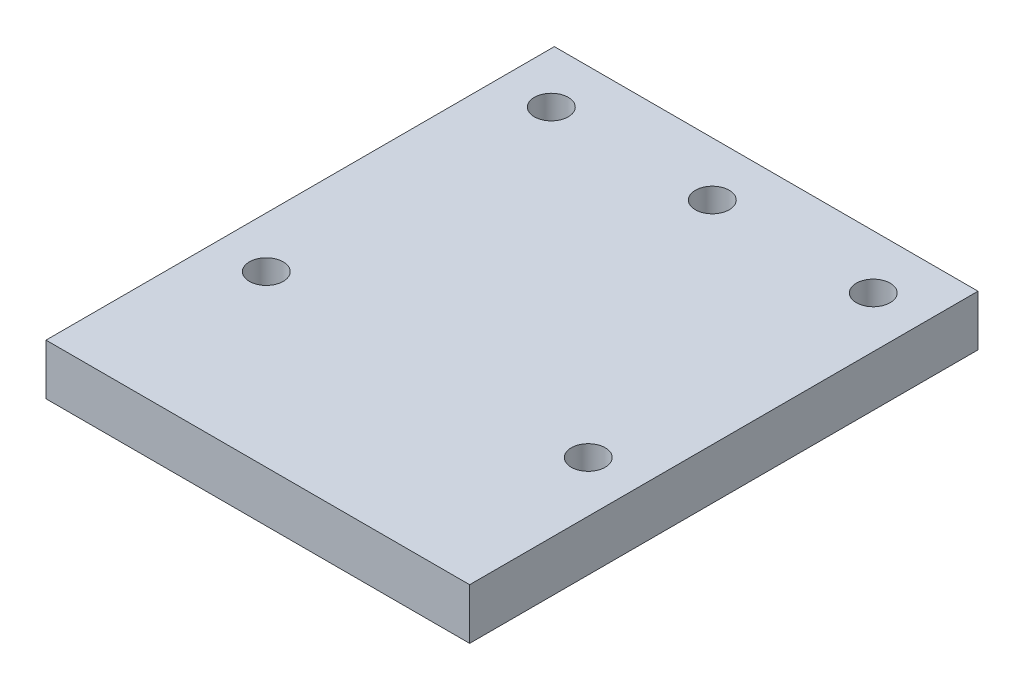
ISO-10303-21;
HEADER;
FILE_DESCRIPTION(('STEP AP214'),'2;1');
FILE_NAME('part.step','',(''),(''),'','','');
FILE_SCHEMA(('AUTOMOTIVE_DESIGN { 1 0 10303 214 1 1 1 1 }'));
ENDSEC;
DATA;
#1=APPLICATION_CONTEXT('core data for automotive mechanical design processes');
#2=APPLICATION_PROTOCOL_DEFINITION('international standard','automotive_design',2000,#1);
#3=PRODUCT_CONTEXT('',#1,'mechanical');
#4=PRODUCT('Part','Part','',(#3));
#5=PRODUCT_RELATED_PRODUCT_CATEGORY('part','',(#4));
#6=PRODUCT_DEFINITION_FORMATION('','',#4);
#7=PRODUCT_DEFINITION_CONTEXT('part definition',#1,'design');
#8=PRODUCT_DEFINITION('design','',#6,#7);
#9=PRODUCT_DEFINITION_SHAPE('','',#8);
#10=(LENGTH_UNIT() NAMED_UNIT(*) SI_UNIT(.MILLI.,.METRE.));
#11=(NAMED_UNIT(*) PLANE_ANGLE_UNIT() SI_UNIT($,.RADIAN.));
#12=(NAMED_UNIT(*) SI_UNIT($,.STERADIAN.) SOLID_ANGLE_UNIT());
#13=UNCERTAINTY_MEASURE_WITH_UNIT(LENGTH_MEASURE(1.E-05),#10,'distance_accuracy_value','');
#14=(GEOMETRIC_REPRESENTATION_CONTEXT(3) GLOBAL_UNCERTAINTY_ASSIGNED_CONTEXT((#13)) GLOBAL_UNIT_ASSIGNED_CONTEXT((#10,
#11,#12)) REPRESENTATION_CONTEXT('',''));
#15=CARTESIAN_POINT('',(0.,0.,0.));
#16=DIRECTION('',(0.,0.,1.));
#17=DIRECTION('',(1.,0.,0.));
#18=AXIS2_PLACEMENT_3D('',#15,#16,#17);
#19=CARTESIAN_POINT('',(0.,3.,0.));
#20=DIRECTION('',(0.,1.,0.));
#21=DIRECTION('',(0.,0.,1.));
#22=AXIS2_PLACEMENT_3D('',#19,#20,#21);
#23=PLANE('',#22);
#24=CARTESIAN_POINT('',(22.,3.,3.18));
#25=DIRECTION('',(0.,1.,0.));
#26=DIRECTION('',(0.,0.,1.));
#27=AXIS2_PLACEMENT_3D('',#24,#25,#26);
#28=CIRCLE('',#27,0.999999999999998);
#29=CARTESIAN_POINT('',(22.,3.,4.18));
#30=VERTEX_POINT('',#29);
#31=EDGE_CURVE('E154',#30,#30,#28,.T.);
#32=ORIENTED_EDGE('',*,*,#31,.F.);
#33=EDGE_LOOP('',(#32));
#34=FACE_BOUND('',#33,.T.);
#35=CARTESIAN_POINT('',(3.,3.,20.));
#36=DIRECTION('',(0.,1.,0.));
#37=DIRECTION('',(0.,0.,1.));
#38=AXIS2_PLACEMENT_3D('',#35,#36,#37);
#39=CIRCLE('',#38,1.);
#40=CARTESIAN_POINT('',(3.,3.,21.));
#41=VERTEX_POINT('',#40);
#42=EDGE_CURVE('E138',#41,#41,#39,.T.);
#43=ORIENTED_EDGE('',*,*,#42,.F.);
#44=EDGE_LOOP('',(#43));
#45=FACE_BOUND('',#44,.T.);
#46=DIRECTION('',(0.,0.,1.));
#47=VECTOR('',#46,1.);
#48=CARTESIAN_POINT('',(0.,3.,0.));
#49=LINE('',#48,#47);
#50=CARTESIAN_POINT('',(0.,3.,0.));
#51=VERTEX_POINT('',#50);
#52=CARTESIAN_POINT('',(0.,3.,30.));
#53=VERTEX_POINT('',#52);
#54=EDGE_CURVE('E96',#51,#53,#49,.T.);
#55=ORIENTED_EDGE('',*,*,#54,.T.);
#56=DIRECTION('',(1.,0.,0.));
#57=VECTOR('',#56,1.);
#58=CARTESIAN_POINT('',(0.,3.,30.));
#59=LINE('',#58,#57);
#60=CARTESIAN_POINT('',(25.,3.,30.));
#61=VERTEX_POINT('',#60);
#62=EDGE_CURVE('E91',#53,#61,#59,.T.);
#63=ORIENTED_EDGE('',*,*,#62,.T.);
#64=DIRECTION('',(0.,0.,-1.));
#65=VECTOR('',#64,1.);
#66=CARTESIAN_POINT('',(25.,3.,0.));
#67=LINE('',#66,#65);
#68=CARTESIAN_POINT('',(25.,3.,0.));
#69=VERTEX_POINT('',#68);
#70=EDGE_CURVE('E94',#61,#69,#67,.T.);
#71=ORIENTED_EDGE('',*,*,#70,.T.);
#72=DIRECTION('',(-1.,0.,0.));
#73=VECTOR('',#72,1.);
#74=CARTESIAN_POINT('',(0.,3.,0.));
#75=LINE('',#74,#73);
#76=EDGE_CURVE('E61',#69,#51,#75,.T.);
#77=ORIENTED_EDGE('',*,*,#76,.T.);
#78=EDGE_LOOP('',(#55,#63,#71,#77));
#79=FACE_BOUND('',#78,.T.);
#80=CARTESIAN_POINT('',(12.5,3.,3.18));
#81=DIRECTION('',(0.,1.,0.));
#82=DIRECTION('',(0.,0.,1.));
#83=AXIS2_PLACEMENT_3D('',#80,#81,#82);
#84=CIRCLE('',#83,1.);
#85=CARTESIAN_POINT('',(12.5,3.,4.18));
#86=VERTEX_POINT('',#85);
#87=EDGE_CURVE('E116',#86,#86,#84,.T.);
#88=ORIENTED_EDGE('',*,*,#87,.F.);
#89=EDGE_LOOP('',(#88));
#90=FACE_BOUND('',#89,.T.);
#91=CARTESIAN_POINT('',(22.,3.,20.));
#92=DIRECTION('',(0.,1.,0.));
#93=DIRECTION('',(0.,0.,1.));
#94=AXIS2_PLACEMENT_3D('',#91,#92,#93);
#95=CIRCLE('',#94,0.999999999999998);
#96=CARTESIAN_POINT('',(22.,3.,21.));
#97=VERTEX_POINT('',#96);
#98=EDGE_CURVE('E146',#97,#97,#95,.T.);
#99=ORIENTED_EDGE('',*,*,#98,.F.);
#100=EDGE_LOOP('',(#99));
#101=FACE_BOUND('',#100,.T.);
#102=CARTESIAN_POINT('',(3.,3.,3.18));
#103=DIRECTION('',(0.,1.,0.));
#104=DIRECTION('',(0.,0.,1.));
#105=AXIS2_PLACEMENT_3D('',#102,#103,#104);
#106=CIRCLE('',#105,1.);
#107=CARTESIAN_POINT('',(3.,3.,4.18));
#108=VERTEX_POINT('',#107);
#109=EDGE_CURVE('E162',#108,#108,#106,.T.);
#110=ORIENTED_EDGE('',*,*,#109,.F.);
#111=EDGE_LOOP('',(#110));
#112=FACE_BOUND('',#111,.T.);
#113=ADVANCED_FACE('F43',(#34,#45,#79,#90,#101,#112),#23,.T.);
#114=CARTESIAN_POINT('',(0.,0.,0.));
#115=DIRECTION('',(0.,1.,0.));
#116=DIRECTION('',(0.,0.,1.));
#117=AXIS2_PLACEMENT_3D('',#114,#115,#116);
#118=PLANE('',#117);
#119=DIRECTION('',(0.,0.,1.));
#120=VECTOR('',#119,1.);
#121=CARTESIAN_POINT('',(0.,0.,0.));
#122=LINE('',#121,#120);
#123=CARTESIAN_POINT('',(0.,0.,0.));
#124=VERTEX_POINT('',#123);
#125=CARTESIAN_POINT('',(0.,0.,30.));
#126=VERTEX_POINT('',#125);
#127=EDGE_CURVE('E112',#124,#126,#122,.T.);
#128=ORIENTED_EDGE('',*,*,#127,.F.);
#129=DIRECTION('',(-1.,0.,0.));
#130=VECTOR('',#129,1.);
#131=CARTESIAN_POINT('',(0.,0.,0.));
#132=LINE('',#131,#130);
#133=CARTESIAN_POINT('',(25.,0.,0.));
#134=VERTEX_POINT('',#133);
#135=EDGE_CURVE('E84',#134,#124,#132,.T.);
#136=ORIENTED_EDGE('',*,*,#135,.F.);
#137=DIRECTION('',(0.,0.,-1.));
#138=VECTOR('',#137,1.);
#139=CARTESIAN_POINT('',(25.,0.,0.));
#140=LINE('',#139,#138);
#141=CARTESIAN_POINT('',(25.,0.,30.));
#142=VERTEX_POINT('',#141);
#143=EDGE_CURVE('E78',#142,#134,#140,.T.);
#144=ORIENTED_EDGE('',*,*,#143,.F.);
#145=DIRECTION('',(1.,0.,0.));
#146=VECTOR('',#145,1.);
#147=CARTESIAN_POINT('',(0.,0.,30.));
#148=LINE('',#147,#146);
#149=EDGE_CURVE('E101',#126,#142,#148,.T.);
#150=ORIENTED_EDGE('',*,*,#149,.F.);
#151=EDGE_LOOP('',(#128,#136,#144,#150));
#152=FACE_BOUND('',#151,.T.);
#153=CARTESIAN_POINT('',(12.5,0.,3.18));
#154=DIRECTION('',(0.,1.,0.));
#155=DIRECTION('',(0.,0.,1.));
#156=AXIS2_PLACEMENT_3D('',#153,#154,#155);
#157=CIRCLE('',#156,1.);
#158=CARTESIAN_POINT('',(12.5,0.,4.18));
#159=VERTEX_POINT('',#158);
#160=EDGE_CURVE('E134',#159,#159,#157,.T.);
#161=ORIENTED_EDGE('',*,*,#160,.T.);
#162=EDGE_LOOP('',(#161));
#163=FACE_BOUND('',#162,.T.);
#164=CARTESIAN_POINT('',(3.,0.,20.));
#165=DIRECTION('',(0.,1.,0.));
#166=DIRECTION('',(0.,0.,1.));
#167=AXIS2_PLACEMENT_3D('',#164,#165,#166);
#168=CIRCLE('',#167,1.);
#169=CARTESIAN_POINT('',(3.,0.,21.));
#170=VERTEX_POINT('',#169);
#171=EDGE_CURVE('E142',#170,#170,#168,.T.);
#172=ORIENTED_EDGE('',*,*,#171,.T.);
#173=EDGE_LOOP('',(#172));
#174=FACE_BOUND('',#173,.T.);
#175=CARTESIAN_POINT('',(22.,0.,20.));
#176=DIRECTION('',(0.,1.,0.));
#177=DIRECTION('',(0.,0.,1.));
#178=AXIS2_PLACEMENT_3D('',#175,#176,#177);
#179=CIRCLE('',#178,0.999999999999998);
#180=CARTESIAN_POINT('',(22.,0.,21.));
#181=VERTEX_POINT('',#180);
#182=EDGE_CURVE('E150',#181,#181,#179,.T.);
#183=ORIENTED_EDGE('',*,*,#182,.T.);
#184=EDGE_LOOP('',(#183));
#185=FACE_BOUND('',#184,.T.);
#186=CARTESIAN_POINT('',(22.,0.,3.18));
#187=DIRECTION('',(0.,1.,0.));
#188=DIRECTION('',(0.,0.,1.));
#189=AXIS2_PLACEMENT_3D('',#186,#187,#188);
#190=CIRCLE('',#189,0.999999999999998);
#191=CARTESIAN_POINT('',(22.,0.,4.18));
#192=VERTEX_POINT('',#191);
#193=EDGE_CURVE('E158',#192,#192,#190,.T.);
#194=ORIENTED_EDGE('',*,*,#193,.T.);
#195=EDGE_LOOP('',(#194));
#196=FACE_BOUND('',#195,.T.);
#197=CARTESIAN_POINT('',(3.,0.,3.18));
#198=DIRECTION('',(0.,1.,0.));
#199=DIRECTION('',(0.,0.,1.));
#200=AXIS2_PLACEMENT_3D('',#197,#198,#199);
#201=CIRCLE('',#200,1.);
#202=CARTESIAN_POINT('',(3.,0.,4.18));
#203=VERTEX_POINT('',#202);
#204=EDGE_CURVE('E166',#203,#203,#201,.T.);
#205=ORIENTED_EDGE('',*,*,#204,.T.);
#206=EDGE_LOOP('',(#205));
#207=FACE_BOUND('',#206,.T.);
#208=ADVANCED_FACE('F129',(#152,#163,#174,#185,#196,#207),#118,.F.);
#209=CARTESIAN_POINT('',(0.,3.,0.));
#210=DIRECTION('',(1.,0.,0.));
#211=DIRECTION('',(0.,0.,-1.));
#212=AXIS2_PLACEMENT_3D('',#209,#210,#211);
#213=PLANE('',#212);
#214=ORIENTED_EDGE('',*,*,#127,.T.);
#215=DIRECTION('',(0.,-1.,0.));
#216=VECTOR('',#215,1.);
#217=CARTESIAN_POINT('',(0.,3.,30.));
#218=LINE('',#217,#216);
#219=EDGE_CURVE('E11',#53,#126,#218,.T.);
#220=ORIENTED_EDGE('',*,*,#219,.F.);
#221=ORIENTED_EDGE('',*,*,#54,.F.);
#222=DIRECTION('',(0.,-1.,0.));
#223=VECTOR('',#222,1.);
#224=CARTESIAN_POINT('',(0.,3.,0.));
#225=LINE('',#224,#223);
#226=EDGE_CURVE('E108',#51,#124,#225,.T.);
#227=ORIENTED_EDGE('',*,*,#226,.T.);
#228=EDGE_LOOP('',(#214,#220,#221,#227));
#229=FACE_BOUND('',#228,.T.);
#230=ADVANCED_FACE('F45',(#229),#213,.F.);
#231=CARTESIAN_POINT('',(0.,3.,30.));
#232=DIRECTION('',(0.,0.,-1.));
#233=DIRECTION('',(-1.,0.,0.));
#234=AXIS2_PLACEMENT_3D('',#231,#232,#233);
#235=PLANE('',#234);
#236=ORIENTED_EDGE('',*,*,#149,.T.);
#237=DIRECTION('',(0.,-1.,0.));
#238=VECTOR('',#237,1.);
#239=CARTESIAN_POINT('',(25.,3.,30.));
#240=LINE('',#239,#238);
#241=EDGE_CURVE('E53',#61,#142,#240,.T.);
#242=ORIENTED_EDGE('',*,*,#241,.F.);
#243=ORIENTED_EDGE('',*,*,#62,.F.);
#244=ORIENTED_EDGE('',*,*,#219,.T.);
#245=EDGE_LOOP('',(#236,#242,#243,#244));
#246=FACE_BOUND('',#245,.T.);
#247=ADVANCED_FACE('F100',(#246),#235,.F.);
#248=CARTESIAN_POINT('',(25.,3.,0.));
#249=DIRECTION('',(-1.,0.,0.));
#250=DIRECTION('',(0.,0.,1.));
#251=AXIS2_PLACEMENT_3D('',#248,#249,#250);
#252=PLANE('',#251);
#253=ORIENTED_EDGE('',*,*,#143,.T.);
#254=DIRECTION('',(0.,-1.,0.));
#255=VECTOR('',#254,1.);
#256=CARTESIAN_POINT('',(25.,3.,0.));
#257=LINE('',#256,#255);
#258=EDGE_CURVE('E103',#69,#134,#257,.T.);
#259=ORIENTED_EDGE('',*,*,#258,.F.);
#260=ORIENTED_EDGE('',*,*,#70,.F.);
#261=ORIENTED_EDGE('',*,*,#241,.T.);
#262=EDGE_LOOP('',(#253,#259,#260,#261));
#263=FACE_BOUND('',#262,.T.);
#264=ADVANCED_FACE('F104',(#263),#252,.F.);
#265=CARTESIAN_POINT('',(0.,3.,0.));
#266=DIRECTION('',(0.,0.,1.));
#267=DIRECTION('',(1.,0.,0.));
#268=AXIS2_PLACEMENT_3D('',#265,#266,#267);
#269=PLANE('',#268);
#270=ORIENTED_EDGE('',*,*,#135,.T.);
#271=ORIENTED_EDGE('',*,*,#226,.F.);
#272=ORIENTED_EDGE('',*,*,#76,.F.);
#273=ORIENTED_EDGE('',*,*,#258,.T.);
#274=EDGE_LOOP('',(#270,#271,#272,#273));
#275=FACE_BOUND('',#274,.T.);
#276=ADVANCED_FACE('F126',(#275),#269,.F.);
#277=CARTESIAN_POINT('',(12.5,3.,3.18));
#278=DIRECTION('',(0.,-1.,0.));
#279=DIRECTION('',(0.,0.,-1.));
#280=AXIS2_PLACEMENT_3D('',#277,#278,#279);
#281=CYLINDRICAL_SURFACE('',#280,1.);
#282=ORIENTED_EDGE('',*,*,#87,.T.);
#283=EDGE_LOOP('',(#282));
#284=FACE_BOUND('',#283,.T.);
#285=ORIENTED_EDGE('',*,*,#160,.F.);
#286=EDGE_LOOP('',(#285));
#287=FACE_BOUND('',#286,.T.);
#288=ADVANCED_FACE('F187',(#284,#287),#281,.F.);
#289=CARTESIAN_POINT('',(3.,3.,20.));
#290=DIRECTION('',(0.,-1.,0.));
#291=DIRECTION('',(0.,0.,-1.));
#292=AXIS2_PLACEMENT_3D('',#289,#290,#291);
#293=CYLINDRICAL_SURFACE('',#292,1.);
#294=ORIENTED_EDGE('',*,*,#42,.T.);
#295=EDGE_LOOP('',(#294));
#296=FACE_BOUND('',#295,.T.);
#297=ORIENTED_EDGE('',*,*,#171,.F.);
#298=EDGE_LOOP('',(#297));
#299=FACE_BOUND('',#298,.T.);
#300=ADVANCED_FACE('F241',(#296,#299),#293,.F.);
#301=CARTESIAN_POINT('',(22.,3.,20.));
#302=DIRECTION('',(0.,-1.,0.));
#303=DIRECTION('',(0.,0.,-1.));
#304=AXIS2_PLACEMENT_3D('',#301,#302,#303);
#305=CYLINDRICAL_SURFACE('',#304,0.999999999999998);
#306=ORIENTED_EDGE('',*,*,#98,.T.);
#307=EDGE_LOOP('',(#306));
#308=FACE_BOUND('',#307,.T.);
#309=ORIENTED_EDGE('',*,*,#182,.F.);
#310=EDGE_LOOP('',(#309));
#311=FACE_BOUND('',#310,.T.);
#312=ADVANCED_FACE('F250',(#308,#311),#305,.F.);
#313=CARTESIAN_POINT('',(22.,3.,3.18));
#314=DIRECTION('',(0.,-1.,0.));
#315=DIRECTION('',(0.,0.,-1.));
#316=AXIS2_PLACEMENT_3D('',#313,#314,#315);
#317=CYLINDRICAL_SURFACE('',#316,0.999999999999998);
#318=ORIENTED_EDGE('',*,*,#31,.T.);
#319=EDGE_LOOP('',(#318));
#320=FACE_BOUND('',#319,.T.);
#321=ORIENTED_EDGE('',*,*,#193,.F.);
#322=EDGE_LOOP('',(#321));
#323=FACE_BOUND('',#322,.T.);
#324=ADVANCED_FACE('F259',(#320,#323),#317,.F.);
#325=CARTESIAN_POINT('',(3.,3.,3.18));
#326=DIRECTION('',(0.,-1.,0.));
#327=DIRECTION('',(0.,0.,-1.));
#328=AXIS2_PLACEMENT_3D('',#325,#326,#327);
#329=CYLINDRICAL_SURFACE('',#328,1.);
#330=ORIENTED_EDGE('',*,*,#109,.T.);
#331=EDGE_LOOP('',(#330));
#332=FACE_BOUND('',#331,.T.);
#333=ORIENTED_EDGE('',*,*,#204,.F.);
#334=EDGE_LOOP('',(#333));
#335=FACE_BOUND('',#334,.T.);
#336=ADVANCED_FACE('F174',(#332,#335),#329,.F.);
#337=CLOSED_SHELL('',(#113,#208,#230,#247,#264,#276,#288,#300,#312,#324,#336));
#338=MANIFOLD_SOLID_BREP('B2',#337);
#339=ADVANCED_BREP_SHAPE_REPRESENTATION('',(#18,#338),#14);
#340=SHAPE_DEFINITION_REPRESENTATION(#9,#339);
ENDSEC;
END-ISO-10303-21;
